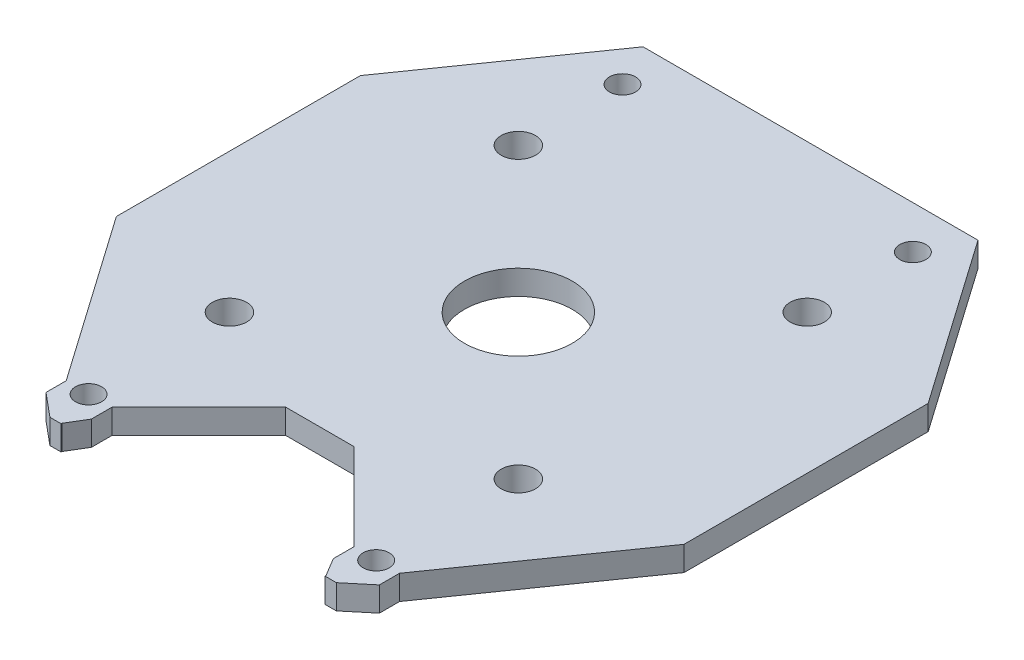
ISO-10303-21;
HEADER;
FILE_DESCRIPTION(('STEP AP214'),'2;1');
FILE_NAME('part.step','',(''),(''),'','','');
FILE_SCHEMA(('AUTOMOTIVE_DESIGN { 1 0 10303 214 1 1 1 1 }'));
ENDSEC;
DATA;
#1=APPLICATION_CONTEXT('core data for automotive mechanical design processes');
#2=APPLICATION_PROTOCOL_DEFINITION('international standard','automotive_design',2000,#1);
#3=PRODUCT_CONTEXT('',#1,'mechanical');
#4=PRODUCT('Part','Part','',(#3));
#5=PRODUCT_RELATED_PRODUCT_CATEGORY('part','',(#4));
#6=PRODUCT_DEFINITION_FORMATION('','',#4);
#7=PRODUCT_DEFINITION_CONTEXT('part definition',#1,'design');
#8=PRODUCT_DEFINITION('design','',#6,#7);
#9=PRODUCT_DEFINITION_SHAPE('','',#8);
#10=(LENGTH_UNIT() NAMED_UNIT(*) SI_UNIT(.MILLI.,.METRE.));
#11=(NAMED_UNIT(*) PLANE_ANGLE_UNIT() SI_UNIT($,.RADIAN.));
#12=(NAMED_UNIT(*) SI_UNIT($,.STERADIAN.) SOLID_ANGLE_UNIT());
#13=UNCERTAINTY_MEASURE_WITH_UNIT(LENGTH_MEASURE(1.E-05),#10,'distance_accuracy_value','');
#14=(GEOMETRIC_REPRESENTATION_CONTEXT(3) GLOBAL_UNCERTAINTY_ASSIGNED_CONTEXT((#13)) GLOBAL_UNIT_ASSIGNED_CONTEXT((#10,
#11,#12)) REPRESENTATION_CONTEXT('',''));
#15=CARTESIAN_POINT('',(0.,0.,0.));
#16=DIRECTION('',(0.,0.,1.));
#17=DIRECTION('',(1.,0.,0.));
#18=AXIS2_PLACEMENT_3D('',#15,#16,#17);
#19=CARTESIAN_POINT('',(65.7919970779048,8.,-46.0680523078203));
#20=DIRECTION('',(-0.819152044288991,0.,0.573576436351048));
#21=DIRECTION('',(0.573576436351048,0.,0.819152044288991));
#22=AXIS2_PLACEMENT_3D('',#19,#20,#21);
#23=PLANE('',#22);
#24=DIRECTION('',(-0.573576436351048,0.,-0.819152044288991));
#25=VECTOR('',#24,1.);
#26=CARTESIAN_POINT('',(65.7919970779048,5.,-46.0680523078203));
#27=LINE('',#26,#25);
#28=CARTESIAN_POINT('',(34.739410908776,5.,-90.4157413494491));
#29=VERTEX_POINT('',#28);
#30=CARTESIAN_POINT('',(20.4958865898895,5.,-110.75760221445));
#31=VERTEX_POINT('',#30);
#32=EDGE_CURVE('E253',#29,#31,#27,.T.);
#33=ORIENTED_EDGE('',*,*,#32,.T.);
#34=DIRECTION('',(0.,-1.,0.));
#35=VECTOR('',#34,1.);
#36=CARTESIAN_POINT('',(20.4958865898895,8.,-110.75760221445));
#37=LINE('',#36,#35);
#38=CARTESIAN_POINT('',(20.4958865898895,8.,-110.75760221445));
#39=VERTEX_POINT('',#38);
#40=EDGE_CURVE('E11',#39,#31,#37,.T.);
#41=ORIENTED_EDGE('',*,*,#40,.F.);
#42=DIRECTION('',(-0.573576436351048,0.,-0.819152044288991));
#43=VECTOR('',#42,1.);
#44=CARTESIAN_POINT('',(65.7919970779048,8.,-46.0680523078203));
#45=LINE('',#44,#43);
#46=CARTESIAN_POINT('',(34.739410908776,8.,-90.4157413494491));
#47=VERTEX_POINT('',#46);
#48=EDGE_CURVE('E428',#47,#39,#45,.T.);
#49=ORIENTED_EDGE('',*,*,#48,.F.);
#50=DIRECTION('',(0.,-1.,0.));
#51=VECTOR('',#50,1.);
#52=CARTESIAN_POINT('',(34.739410908776,8.,-90.4157413494491));
#53=LINE('',#52,#51);
#54=EDGE_CURVE('E240',#47,#29,#53,.T.);
#55=ORIENTED_EDGE('',*,*,#54,.T.);
#56=EDGE_LOOP('',(#33,#41,#49,#55));
#57=FACE_BOUND('',#56,.T.);
#58=ADVANCED_FACE('F44',(#57),#23,.F.);
#59=CARTESIAN_POINT('',(0.,8.,-110.75760221445));
#60=DIRECTION('',(0.,0.,1.));
#61=DIRECTION('',(1.,0.,0.));
#62=AXIS2_PLACEMENT_3D('',#59,#60,#61);
#63=PLANE('',#62);
#64=DIRECTION('',(-1.,0.,0.));
#65=VECTOR('',#64,1.);
#66=CARTESIAN_POINT('',(0.,5.,-110.75760221445));
#67=LINE('',#66,#65);
#68=CARTESIAN_POINT('',(-20.4958865898895,5.,-110.75760221445));
#69=VERTEX_POINT('',#68);
#70=EDGE_CURVE('E256',#31,#69,#67,.T.);
#71=ORIENTED_EDGE('',*,*,#70,.T.);
#72=DIRECTION('',(0.,-1.,0.));
#73=VECTOR('',#72,1.);
#74=CARTESIAN_POINT('',(-20.4958865898895,8.,-110.75760221445));
#75=LINE('',#74,#73);
#76=CARTESIAN_POINT('',(-20.4958865898895,8.,-110.75760221445));
#77=VERTEX_POINT('',#76);
#78=EDGE_CURVE('E53',#77,#69,#75,.T.);
#79=ORIENTED_EDGE('',*,*,#78,.F.);
#80=DIRECTION('',(-1.,0.,0.));
#81=VECTOR('',#80,1.);
#82=CARTESIAN_POINT('',(0.,8.,-110.75760221445));
#83=LINE('',#82,#81);
#84=EDGE_CURVE('E146',#39,#77,#83,.T.);
#85=ORIENTED_EDGE('',*,*,#84,.F.);
#86=ORIENTED_EDGE('',*,*,#40,.T.);
#87=EDGE_LOOP('',(#71,#79,#85,#86));
#88=FACE_BOUND('',#87,.T.);
#89=ADVANCED_FACE('F448',(#88),#63,.F.);
#90=CARTESIAN_POINT('',(-65.7919970779048,8.,-46.0680523078203));
#91=DIRECTION('',(0.819152044288991,0.,0.573576436351048));
#92=DIRECTION('',(0.573576436351048,0.,-0.819152044288991));
#93=AXIS2_PLACEMENT_3D('',#90,#91,#92);
#94=PLANE('',#93);
#95=DIRECTION('',(-0.573576436351048,0.,0.819152044288991));
#96=VECTOR('',#95,1.);
#97=CARTESIAN_POINT('',(-65.7919970779048,5.,-46.0680523078203));
#98=LINE('',#97,#96);
#99=CARTESIAN_POINT('',(-34.739410908776,5.,-90.4157413494491));
#100=VERTEX_POINT('',#99);
#101=EDGE_CURVE('E258',#69,#100,#98,.T.);
#102=ORIENTED_EDGE('',*,*,#101,.T.);
#103=DIRECTION('',(0.,-1.,0.));
#104=VECTOR('',#103,1.);
#105=CARTESIAN_POINT('',(-34.739410908776,8.,-90.4157413494491));
#106=LINE('',#105,#104);
#107=CARTESIAN_POINT('',(-34.739410908776,8.,-90.4157413494491));
#108=VERTEX_POINT('',#107);
#109=EDGE_CURVE('E359',#108,#100,#106,.T.);
#110=ORIENTED_EDGE('',*,*,#109,.F.);
#111=DIRECTION('',(-0.573576436351048,0.,0.819152044288991));
#112=VECTOR('',#111,1.);
#113=CARTESIAN_POINT('',(-65.7919970779048,8.,-46.0680523078203));
#114=LINE('',#113,#112);
#115=EDGE_CURVE('E367',#77,#108,#114,.T.);
#116=ORIENTED_EDGE('',*,*,#115,.F.);
#117=ORIENTED_EDGE('',*,*,#78,.T.);
#118=EDGE_LOOP('',(#102,#110,#116,#117));
#119=FACE_BOUND('',#118,.T.);
#120=ADVANCED_FACE('F365',(#119),#94,.F.);
#121=CARTESIAN_POINT('',(-34.739410908776,8.,0.));
#122=DIRECTION('',(1.,0.,0.));
#123=DIRECTION('',(0.,0.,-1.));
#124=AXIS2_PLACEMENT_3D('',#121,#122,#123);
#125=PLANE('',#124);
#126=DIRECTION('',(0.,0.,1.));
#127=VECTOR('',#126,1.);
#128=CARTESIAN_POINT('',(-34.739410908776,5.,0.));
#129=LINE('',#128,#127);
#130=CARTESIAN_POINT('',(-34.739410908776,5.,-60.5418608650007));
#131=VERTEX_POINT('',#130);
#132=EDGE_CURVE('E260',#100,#131,#129,.T.);
#133=ORIENTED_EDGE('',*,*,#132,.T.);
#134=DIRECTION('',(0.,-1.,0.));
#135=VECTOR('',#134,1.);
#136=CARTESIAN_POINT('',(-34.739410908776,8.,-60.5418608650007));
#137=LINE('',#136,#135);
#138=CARTESIAN_POINT('',(-34.739410908776,8.,-60.5418608650007));
#139=VERTEX_POINT('',#138);
#140=EDGE_CURVE('E356',#139,#131,#137,.T.);
#141=ORIENTED_EDGE('',*,*,#140,.F.);
#142=DIRECTION('',(0.,0.,1.));
#143=VECTOR('',#142,1.);
#144=CARTESIAN_POINT('',(-34.739410908776,8.,0.));
#145=LINE('',#144,#143);
#146=EDGE_CURVE('E386',#108,#139,#145,.T.);
#147=ORIENTED_EDGE('',*,*,#146,.F.);
#148=ORIENTED_EDGE('',*,*,#109,.T.);
#149=EDGE_LOOP('',(#133,#141,#147,#148));
#150=FACE_BOUND('',#149,.T.);
#151=ADVANCED_FACE('F377',(#150),#125,.F.);
#152=CARTESIAN_POINT('',(5.13487534832138,8.,-3.59547842666179));
#153=DIRECTION('',(0.819152044288995,0.,-0.573576436351041));
#154=DIRECTION('',(-0.573576436351041,0.,-0.819152044288995));
#155=AXIS2_PLACEMENT_3D('',#152,#153,#154);
#156=PLANE('',#155);
#157=DIRECTION('',(0.573576436351041,0.,0.819152044288995));
#158=VECTOR('',#157,1.);
#159=CARTESIAN_POINT('',(5.13487534832138,5.,-3.59547842666179));
#160=LINE('',#159,#158);
#161=CARTESIAN_POINT('',(-20.3999999999998,5.,-40.0630597577755));
#162=VERTEX_POINT('',#161);
#163=EDGE_CURVE('E262',#131,#162,#160,.T.);
#164=ORIENTED_EDGE('',*,*,#163,.T.);
#165=DIRECTION('',(0.,-1.,0.));
#166=VECTOR('',#165,1.);
#167=CARTESIAN_POINT('',(-20.3999999999998,8.,-40.0630597577755));
#168=LINE('',#167,#166);
#169=CARTESIAN_POINT('',(-20.3999999999998,8.,-40.0630597577755));
#170=VERTEX_POINT('',#169);
#171=EDGE_CURVE('E353',#170,#162,#168,.T.);
#172=ORIENTED_EDGE('',*,*,#171,.F.);
#173=DIRECTION('',(0.573576436351041,0.,0.819152044288995));
#174=VECTOR('',#173,1.);
#175=CARTESIAN_POINT('',(5.13487534832138,8.,-3.59547842666179));
#176=LINE('',#175,#174);
#177=EDGE_CURVE('E383',#139,#170,#176,.T.);
#178=ORIENTED_EDGE('',*,*,#177,.F.);
#179=ORIENTED_EDGE('',*,*,#140,.T.);
#180=EDGE_LOOP('',(#164,#172,#178,#179));
#181=FACE_BOUND('',#180,.T.);
#182=ADVANCED_FACE('F381',(#181),#156,.F.);
#183=CARTESIAN_POINT('',(-20.3999999999998,8.,0.));
#184=DIRECTION('',(1.,0.,0.));
#185=DIRECTION('',(0.,0.,-1.));
#186=AXIS2_PLACEMENT_3D('',#183,#184,#185);
#187=PLANE('',#186);
#188=DIRECTION('',(0.,0.,1.));
#189=VECTOR('',#188,1.);
#190=CARTESIAN_POINT('',(-20.3999999999998,5.,0.));
#191=LINE('',#190,#189);
#192=CARTESIAN_POINT('',(-20.3999999999998,5.,-37.5936749891967));
#193=VERTEX_POINT('',#192);
#194=EDGE_CURVE('E264',#162,#193,#191,.T.);
#195=ORIENTED_EDGE('',*,*,#194,.T.);
#196=DIRECTION('',(0.,-1.,0.));
#197=VECTOR('',#196,1.);
#198=CARTESIAN_POINT('',(-20.3999999999998,8.,-37.5936749891967));
#199=LINE('',#198,#197);
#200=CARTESIAN_POINT('',(-20.3999999999998,8.,-37.5936749891967));
#201=VERTEX_POINT('',#200);
#202=EDGE_CURVE('E350',#201,#193,#199,.T.);
#203=ORIENTED_EDGE('',*,*,#202,.F.);
#204=DIRECTION('',(0.,0.,1.));
#205=VECTOR('',#204,1.);
#206=CARTESIAN_POINT('',(-20.3999999999998,8.,0.));
#207=LINE('',#206,#205);
#208=EDGE_CURVE('E385',#170,#201,#207,.T.);
#209=ORIENTED_EDGE('',*,*,#208,.F.);
#210=ORIENTED_EDGE('',*,*,#171,.T.);
#211=EDGE_LOOP('',(#195,#203,#209,#210));
#212=FACE_BOUND('',#211,.T.);
#213=ADVANCED_FACE('F709',(#212),#187,.F.);
#214=CARTESIAN_POINT('',(10.1280368799329,8.,-12.1536442559195));
#215=DIRECTION('',(0.640184399664479,0.,-0.768221279597376));
#216=DIRECTION('',(-0.768221279597376,0.,-0.640184399664479));
#217=AXIS2_PLACEMENT_3D('',#214,#215,#216);
#218=PLANE('',#217);
#219=DIRECTION('',(0.768221279597376,0.,0.640184399664479));
#220=VECTOR('',#219,1.);
#221=CARTESIAN_POINT('',(10.1280368799329,5.,-12.1536442559195));
#222=LINE('',#221,#220);
#223=CARTESIAN_POINT('',(-17.5275900129637,5.,-35.2));
#224=VERTEX_POINT('',#223);
#225=EDGE_CURVE('E266',#193,#224,#222,.T.);
#226=ORIENTED_EDGE('',*,*,#225,.T.);
#227=DIRECTION('',(0.,-1.,0.));
#228=VECTOR('',#227,1.);
#229=CARTESIAN_POINT('',(-17.5275900129637,8.,-35.2));
#230=LINE('',#229,#228);
#231=CARTESIAN_POINT('',(-17.5275900129637,8.,-35.2));
#232=VERTEX_POINT('',#231);
#233=EDGE_CURVE('E347',#232,#224,#230,.T.);
#234=ORIENTED_EDGE('',*,*,#233,.F.);
#235=DIRECTION('',(0.768221279597376,0.,0.640184399664479));
#236=VECTOR('',#235,1.);
#237=CARTESIAN_POINT('',(10.1280368799329,8.,-12.1536442559195));
#238=LINE('',#237,#236);
#239=EDGE_CURVE('E388',#201,#232,#238,.T.);
#240=ORIENTED_EDGE('',*,*,#239,.F.);
#241=ORIENTED_EDGE('',*,*,#202,.T.);
#242=EDGE_LOOP('',(#226,#234,#240,#241));
#243=FACE_BOUND('',#242,.T.);
#244=ADVANCED_FACE('F701',(#243),#218,.F.);
#245=CARTESIAN_POINT('',(0.,8.,-35.2));
#246=DIRECTION('',(0.,0.,-1.));
#247=DIRECTION('',(-1.,0.,0.));
#248=AXIS2_PLACEMENT_3D('',#245,#246,#247);
#249=PLANE('',#248);
#250=DIRECTION('',(1.,0.,0.));
#251=VECTOR('',#250,1.);
#252=CARTESIAN_POINT('',(0.,5.,-35.2));
#253=LINE('',#252,#251);
#254=CARTESIAN_POINT('',(-16.1582607431014,5.,-35.2));
#255=VERTEX_POINT('',#254);
#256=EDGE_CURVE('E268',#224,#255,#253,.T.);
#257=ORIENTED_EDGE('',*,*,#256,.T.);
#258=DIRECTION('',(0.,-1.,0.));
#259=VECTOR('',#258,1.);
#260=CARTESIAN_POINT('',(-16.1582607431014,8.,-35.2));
#261=LINE('',#260,#259);
#262=CARTESIAN_POINT('',(-16.1582607431014,8.,-35.2));
#263=VERTEX_POINT('',#262);
#264=EDGE_CURVE('E344',#263,#255,#261,.T.);
#265=ORIENTED_EDGE('',*,*,#264,.F.);
#266=DIRECTION('',(1.,0.,0.));
#267=VECTOR('',#266,1.);
#268=CARTESIAN_POINT('',(0.,8.,-35.2));
#269=LINE('',#268,#267);
#270=EDGE_CURVE('E394',#232,#263,#269,.T.);
#271=ORIENTED_EDGE('',*,*,#270,.F.);
#272=ORIENTED_EDGE('',*,*,#233,.T.);
#273=EDGE_LOOP('',(#257,#265,#271,#272));
#274=FACE_BOUND('',#273,.T.);
#275=ADVANCED_FACE('F693',(#274),#249,.F.);
#276=CARTESIAN_POINT('',(-16.1582607431014,8.,0.));
#277=DIRECTION('',(-1.,0.,0.));
#278=DIRECTION('',(0.,0.,1.));
#279=AXIS2_PLACEMENT_3D('',#276,#277,#278);
#280=PLANE('',#279);
#281=DIRECTION('',(0.,0.,-1.));
#282=VECTOR('',#281,1.);
#283=CARTESIAN_POINT('',(-16.1582607431014,5.,0.));
#284=LINE('',#283,#282);
#285=CARTESIAN_POINT('',(-16.1582607431014,5.,-35.2916288878207));
#286=VERTEX_POINT('',#285);
#287=EDGE_CURVE('E270',#255,#286,#284,.T.);
#288=ORIENTED_EDGE('',*,*,#287,.T.);
#289=DIRECTION('',(0.,-1.,0.));
#290=VECTOR('',#289,1.);
#291=CARTESIAN_POINT('',(-16.1582607431014,8.,-35.2916288878207));
#292=LINE('',#291,#290);
#293=CARTESIAN_POINT('',(-16.1582607431014,8.,-35.2916288878207));
#294=VERTEX_POINT('',#293);
#295=EDGE_CURVE('E341',#294,#286,#292,.T.);
#296=ORIENTED_EDGE('',*,*,#295,.F.);
#297=DIRECTION('',(0.,0.,-1.));
#298=VECTOR('',#297,1.);
#299=CARTESIAN_POINT('',(-16.1582607431014,8.,0.));
#300=LINE('',#299,#298);
#301=EDGE_CURVE('E396',#263,#294,#300,.T.);
#302=ORIENTED_EDGE('',*,*,#301,.F.);
#303=ORIENTED_EDGE('',*,*,#264,.T.);
#304=EDGE_LOOP('',(#288,#296,#302,#303));
#305=FACE_BOUND('',#304,.T.);
#306=ADVANCED_FACE('F685',(#305),#280,.F.);
#307=CARTESIAN_POINT('',(-27.4509103498484,8.,-16.470546209909));
#308=DIRECTION('',(-0.857492925712545,0.,-0.514495755427526));
#309=DIRECTION('',(-0.514495755427526,0.,0.857492925712545));
#310=AXIS2_PLACEMENT_3D('',#307,#308,#309);
#311=PLANE('',#310);
#312=DIRECTION('',(0.514495755427526,0.,-0.857492925712545));
#313=VECTOR('',#312,1.);
#314=CARTESIAN_POINT('',(-27.4509103498484,5.,-16.470546209909));
#315=LINE('',#314,#313);
#316=CARTESIAN_POINT('',(-14.8,5.,-37.5553967929897));
#317=VERTEX_POINT('',#316);
#318=EDGE_CURVE('E272',#286,#317,#315,.T.);
#319=ORIENTED_EDGE('',*,*,#318,.T.);
#320=DIRECTION('',(0.,-1.,0.));
#321=VECTOR('',#320,1.);
#322=CARTESIAN_POINT('',(-14.8,8.,-37.5553967929897));
#323=LINE('',#322,#321);
#324=CARTESIAN_POINT('',(-14.8,8.,-37.5553967929897));
#325=VERTEX_POINT('',#324);
#326=EDGE_CURVE('E338',#325,#317,#323,.T.);
#327=ORIENTED_EDGE('',*,*,#326,.F.);
#328=DIRECTION('',(0.514495755427526,0.,-0.857492925712545));
#329=VECTOR('',#328,1.);
#330=CARTESIAN_POINT('',(-27.4509103498484,8.,-16.470546209909));
#331=LINE('',#330,#329);
#332=EDGE_CURVE('E398',#294,#325,#331,.T.);
#333=ORIENTED_EDGE('',*,*,#332,.F.);
#334=ORIENTED_EDGE('',*,*,#295,.T.);
#335=EDGE_LOOP('',(#319,#327,#333,#334));
#336=FACE_BOUND('',#335,.T.);
#337=ADVANCED_FACE('F677',(#336),#311,.F.);
#338=CARTESIAN_POINT('',(-14.8,8.,0.));
#339=DIRECTION('',(-1.,0.,0.));
#340=DIRECTION('',(0.,0.,1.));
#341=AXIS2_PLACEMENT_3D('',#338,#339,#340);
#342=PLANE('',#341);
#343=DIRECTION('',(0.,0.,-1.));
#344=VECTOR('',#343,1.);
#345=CARTESIAN_POINT('',(-14.8,5.,0.));
#346=LINE('',#345,#344);
#347=CARTESIAN_POINT('',(-14.8,5.,-40.0828427124746));
#348=VERTEX_POINT('',#347);
#349=EDGE_CURVE('E274',#317,#348,#346,.T.);
#350=ORIENTED_EDGE('',*,*,#349,.T.);
#351=DIRECTION('',(0.,-1.,0.));
#352=VECTOR('',#351,1.);
#353=CARTESIAN_POINT('',(-14.8,8.,-40.0828427124746));
#354=LINE('',#353,#352);
#355=CARTESIAN_POINT('',(-14.8,8.,-40.0828427124746));
#356=VERTEX_POINT('',#355);
#357=EDGE_CURVE('E335',#356,#348,#354,.T.);
#358=ORIENTED_EDGE('',*,*,#357,.F.);
#359=DIRECTION('',(0.,0.,-1.));
#360=VECTOR('',#359,1.);
#361=CARTESIAN_POINT('',(-14.8,8.,0.));
#362=LINE('',#361,#360);
#363=EDGE_CURVE('E400',#325,#356,#362,.T.);
#364=ORIENTED_EDGE('',*,*,#363,.F.);
#365=ORIENTED_EDGE('',*,*,#326,.T.);
#366=EDGE_LOOP('',(#350,#358,#364,#365));
#367=FACE_BOUND('',#366,.T.);
#368=ADVANCED_FACE('F669',(#367),#342,.F.);
#369=CARTESIAN_POINT('',(-27.4414213562373,8.,-27.4414213562373));
#370=DIRECTION('',(-0.707106781186547,0.,-0.707106781186548));
#371=DIRECTION('',(-0.707106781186548,0.,0.707106781186547));
#372=AXIS2_PLACEMENT_3D('',#369,#370,#371);
#373=PLANE('',#372);
#374=DIRECTION('',(0.707106781186548,0.,-0.707106781186547));
#375=VECTOR('',#374,1.);
#376=CARTESIAN_POINT('',(-27.4414213562373,5.,-27.4414213562373));
#377=LINE('',#376,#375);
#378=CARTESIAN_POINT('',(-4.18284271247462,5.,-50.7));
#379=VERTEX_POINT('',#378);
#380=EDGE_CURVE('E276',#348,#379,#377,.T.);
#381=ORIENTED_EDGE('',*,*,#380,.T.);
#382=DIRECTION('',(0.,-1.,0.));
#383=VECTOR('',#382,1.);
#384=CARTESIAN_POINT('',(-4.18284271247462,8.,-50.7));
#385=LINE('',#384,#383);
#386=CARTESIAN_POINT('',(-4.18284271247462,8.,-50.7));
#387=VERTEX_POINT('',#386);
#388=EDGE_CURVE('E332',#387,#379,#385,.T.);
#389=ORIENTED_EDGE('',*,*,#388,.F.);
#390=DIRECTION('',(0.707106781186548,0.,-0.707106781186547));
#391=VECTOR('',#390,1.);
#392=CARTESIAN_POINT('',(-27.4414213562373,8.,-27.4414213562373));
#393=LINE('',#392,#391);
#394=EDGE_CURVE('E402',#356,#387,#393,.T.);
#395=ORIENTED_EDGE('',*,*,#394,.F.);
#396=ORIENTED_EDGE('',*,*,#357,.T.);
#397=EDGE_LOOP('',(#381,#389,#395,#396));
#398=FACE_BOUND('',#397,.T.);
#399=ADVANCED_FACE('F661',(#398),#373,.F.);
#400=CARTESIAN_POINT('',(0.,8.,-50.7));
#401=DIRECTION('',(0.,0.,-1.));
#402=DIRECTION('',(-1.,0.,0.));
#403=AXIS2_PLACEMENT_3D('',#400,#401,#402);
#404=PLANE('',#403);
#405=DIRECTION('',(1.,0.,0.));
#406=VECTOR('',#405,1.);
#407=CARTESIAN_POINT('',(0.,5.,-50.7));
#408=LINE('',#407,#406);
#409=CARTESIAN_POINT('',(4.18284271247474,5.,-50.7));
#410=VERTEX_POINT('',#409);
#411=EDGE_CURVE('E278',#379,#410,#408,.T.);
#412=ORIENTED_EDGE('',*,*,#411,.T.);
#413=DIRECTION('',(0.,-1.,0.));
#414=VECTOR('',#413,1.);
#415=CARTESIAN_POINT('',(4.18284271247474,8.,-50.7));
#416=LINE('',#415,#414);
#417=CARTESIAN_POINT('',(4.18284271247474,8.,-50.7));
#418=VERTEX_POINT('',#417);
#419=EDGE_CURVE('E329',#418,#410,#416,.T.);
#420=ORIENTED_EDGE('',*,*,#419,.F.);
#421=DIRECTION('',(1.,0.,0.));
#422=VECTOR('',#421,1.);
#423=CARTESIAN_POINT('',(0.,8.,-50.7));
#424=LINE('',#423,#422);
#425=EDGE_CURVE('E404',#387,#418,#424,.T.);
#426=ORIENTED_EDGE('',*,*,#425,.F.);
#427=ORIENTED_EDGE('',*,*,#388,.T.);
#428=EDGE_LOOP('',(#412,#420,#426,#427));
#429=FACE_BOUND('',#428,.T.);
#430=ADVANCED_FACE('F653',(#429),#404,.F.);
#431=CARTESIAN_POINT('',(27.4414213562374,8.,-27.4414213562371));
#432=DIRECTION('',(0.707106781186551,0.,-0.707106781186544));
#433=DIRECTION('',(-0.707106781186544,0.,-0.707106781186551));
#434=AXIS2_PLACEMENT_3D('',#431,#432,#433);
#435=PLANE('',#434);
#436=DIRECTION('',(0.707106781186544,0.,0.707106781186551));
#437=VECTOR('',#436,1.);
#438=CARTESIAN_POINT('',(27.4414213562374,5.,-27.4414213562371));
#439=LINE('',#438,#437);
#440=CARTESIAN_POINT('',(14.8,5.,-40.0828427124746));
#441=VERTEX_POINT('',#440);
#442=EDGE_CURVE('E280',#410,#441,#439,.T.);
#443=ORIENTED_EDGE('',*,*,#442,.T.);
#444=DIRECTION('',(0.,-1.,0.));
#445=VECTOR('',#444,1.);
#446=CARTESIAN_POINT('',(14.8,8.,-40.0828427124746));
#447=LINE('',#446,#445);
#448=CARTESIAN_POINT('',(14.8,8.,-40.0828427124746));
#449=VERTEX_POINT('',#448);
#450=EDGE_CURVE('E326',#449,#441,#447,.T.);
#451=ORIENTED_EDGE('',*,*,#450,.F.);
#452=DIRECTION('',(0.707106781186544,0.,0.707106781186551));
#453=VECTOR('',#452,1.);
#454=CARTESIAN_POINT('',(27.4414213562374,8.,-27.4414213562371));
#455=LINE('',#454,#453);
#456=EDGE_CURVE('E406',#418,#449,#455,.T.);
#457=ORIENTED_EDGE('',*,*,#456,.F.);
#458=ORIENTED_EDGE('',*,*,#419,.T.);
#459=EDGE_LOOP('',(#443,#451,#457,#458));
#460=FACE_BOUND('',#459,.T.);
#461=ADVANCED_FACE('F645',(#460),#435,.F.);
#462=CARTESIAN_POINT('',(14.8,8.,0.));
#463=DIRECTION('',(1.,0.,0.));
#464=DIRECTION('',(0.,0.,-1.));
#465=AXIS2_PLACEMENT_3D('',#462,#463,#464);
#466=PLANE('',#465);
#467=DIRECTION('',(0.,0.,1.));
#468=VECTOR('',#467,1.);
#469=CARTESIAN_POINT('',(14.8,5.,0.));
#470=LINE('',#469,#468);
#471=CARTESIAN_POINT('',(14.8,5.,-37.5553967929897));
#472=VERTEX_POINT('',#471);
#473=EDGE_CURVE('E282',#441,#472,#470,.T.);
#474=ORIENTED_EDGE('',*,*,#473,.T.);
#475=DIRECTION('',(0.,-1.,0.));
#476=VECTOR('',#475,1.);
#477=CARTESIAN_POINT('',(14.8,8.,-37.5553967929897));
#478=LINE('',#477,#476);
#479=CARTESIAN_POINT('',(14.8,8.,-37.5553967929897));
#480=VERTEX_POINT('',#479);
#481=EDGE_CURVE('E323',#480,#472,#478,.T.);
#482=ORIENTED_EDGE('',*,*,#481,.F.);
#483=DIRECTION('',(0.,0.,1.));
#484=VECTOR('',#483,1.);
#485=CARTESIAN_POINT('',(14.8,8.,0.));
#486=LINE('',#485,#484);
#487=EDGE_CURVE('E408',#449,#480,#486,.T.);
#488=ORIENTED_EDGE('',*,*,#487,.F.);
#489=ORIENTED_EDGE('',*,*,#450,.T.);
#490=EDGE_LOOP('',(#474,#482,#488,#489));
#491=FACE_BOUND('',#490,.T.);
#492=ADVANCED_FACE('F637',(#491),#466,.F.);
#493=CARTESIAN_POINT('',(27.4509103498484,8.,-16.470546209909));
#494=DIRECTION('',(0.857492925712545,0.,-0.514495755427526));
#495=DIRECTION('',(-0.514495755427526,0.,-0.857492925712545));
#496=AXIS2_PLACEMENT_3D('',#493,#494,#495);
#497=PLANE('',#496);
#498=DIRECTION('',(0.514495755427526,0.,0.857492925712545));
#499=VECTOR('',#498,1.);
#500=CARTESIAN_POINT('',(27.4509103498484,5.,-16.470546209909));
#501=LINE('',#500,#499);
#502=CARTESIAN_POINT('',(16.1582607431014,5.,-35.2916288878207));
#503=VERTEX_POINT('',#502);
#504=EDGE_CURVE('E284',#472,#503,#501,.T.);
#505=ORIENTED_EDGE('',*,*,#504,.T.);
#506=DIRECTION('',(0.,-1.,0.));
#507=VECTOR('',#506,1.);
#508=CARTESIAN_POINT('',(16.1582607431014,8.,-35.2916288878207));
#509=LINE('',#508,#507);
#510=CARTESIAN_POINT('',(16.1582607431014,8.,-35.2916288878207));
#511=VERTEX_POINT('',#510);
#512=EDGE_CURVE('E320',#511,#503,#509,.T.);
#513=ORIENTED_EDGE('',*,*,#512,.F.);
#514=DIRECTION('',(0.514495755427526,0.,0.857492925712545));
#515=VECTOR('',#514,1.);
#516=CARTESIAN_POINT('',(27.4509103498484,8.,-16.470546209909));
#517=LINE('',#516,#515);
#518=EDGE_CURVE('E410',#480,#511,#517,.T.);
#519=ORIENTED_EDGE('',*,*,#518,.F.);
#520=ORIENTED_EDGE('',*,*,#481,.T.);
#521=EDGE_LOOP('',(#505,#513,#519,#520));
#522=FACE_BOUND('',#521,.T.);
#523=ADVANCED_FACE('F629',(#522),#497,.F.);
#524=CARTESIAN_POINT('',(16.1582607431014,8.,0.));
#525=DIRECTION('',(1.,0.,0.));
#526=DIRECTION('',(0.,0.,-1.));
#527=AXIS2_PLACEMENT_3D('',#524,#525,#526);
#528=PLANE('',#527);
#529=DIRECTION('',(0.,0.,1.));
#530=VECTOR('',#529,1.);
#531=CARTESIAN_POINT('',(16.1582607431014,5.,0.));
#532=LINE('',#531,#530);
#533=CARTESIAN_POINT('',(16.1582607431014,5.,-35.2));
#534=VERTEX_POINT('',#533);
#535=EDGE_CURVE('E286',#503,#534,#532,.T.);
#536=ORIENTED_EDGE('',*,*,#535,.T.);
#537=DIRECTION('',(0.,-1.,0.));
#538=VECTOR('',#537,1.);
#539=CARTESIAN_POINT('',(16.1582607431014,8.,-35.2));
#540=LINE('',#539,#538);
#541=CARTESIAN_POINT('',(16.1582607431014,8.,-35.2));
#542=VERTEX_POINT('',#541);
#543=EDGE_CURVE('E317',#542,#534,#540,.T.);
#544=ORIENTED_EDGE('',*,*,#543,.F.);
#545=DIRECTION('',(0.,0.,1.));
#546=VECTOR('',#545,1.);
#547=CARTESIAN_POINT('',(16.1582607431014,8.,0.));
#548=LINE('',#547,#546);
#549=EDGE_CURVE('E412',#511,#542,#548,.T.);
#550=ORIENTED_EDGE('',*,*,#549,.F.);
#551=ORIENTED_EDGE('',*,*,#512,.T.);
#552=EDGE_LOOP('',(#536,#544,#550,#551));
#553=FACE_BOUND('',#552,.T.);
#554=ADVANCED_FACE('F622',(#553),#528,.F.);
#555=CARTESIAN_POINT('',(0.,8.,-35.2));
#556=DIRECTION('',(0.,0.,-1.));
#557=DIRECTION('',(-1.,0.,0.));
#558=AXIS2_PLACEMENT_3D('',#555,#556,#557);
#559=PLANE('',#558);
#560=DIRECTION('',(1.,0.,0.));
#561=VECTOR('',#560,1.);
#562=CARTESIAN_POINT('',(0.,5.,-35.2));
#563=LINE('',#562,#561);
#564=CARTESIAN_POINT('',(17.5275900129637,5.,-35.2));
#565=VERTEX_POINT('',#564);
#566=EDGE_CURVE('E288',#534,#565,#563,.T.);
#567=ORIENTED_EDGE('',*,*,#566,.T.);
#568=DIRECTION('',(0.,-1.,0.));
#569=VECTOR('',#568,1.);
#570=CARTESIAN_POINT('',(17.5275900129637,8.,-35.2));
#571=LINE('',#570,#569);
#572=CARTESIAN_POINT('',(17.5275900129637,8.,-35.2));
#573=VERTEX_POINT('',#572);
#574=EDGE_CURVE('E314',#573,#565,#571,.T.);
#575=ORIENTED_EDGE('',*,*,#574,.F.);
#576=DIRECTION('',(1.,0.,0.));
#577=VECTOR('',#576,1.);
#578=CARTESIAN_POINT('',(0.,8.,-35.2));
#579=LINE('',#578,#577);
#580=EDGE_CURVE('E414',#542,#573,#579,.T.);
#581=ORIENTED_EDGE('',*,*,#580,.F.);
#582=ORIENTED_EDGE('',*,*,#543,.T.);
#583=EDGE_LOOP('',(#567,#575,#581,#582));
#584=FACE_BOUND('',#583,.T.);
#585=ADVANCED_FACE('F420',(#584),#559,.F.);
#586=CARTESIAN_POINT('',(-10.1280368799329,8.,-12.1536442559195));
#587=DIRECTION('',(-0.64018439966448,0.,-0.768221279597376));
#588=DIRECTION('',(-0.768221279597376,0.,0.64018439966448));
#589=AXIS2_PLACEMENT_3D('',#586,#587,#588);
#590=PLANE('',#589);
#591=DIRECTION('',(0.768221279597376,0.,-0.64018439966448));
#592=VECTOR('',#591,1.);
#593=CARTESIAN_POINT('',(-10.1280368799329,5.,-12.1536442559195));
#594=LINE('',#593,#592);
#595=CARTESIAN_POINT('',(20.4,5.,-37.5936749891969));
#596=VERTEX_POINT('',#595);
#597=EDGE_CURVE('E290',#565,#596,#594,.T.);
#598=ORIENTED_EDGE('',*,*,#597,.T.);
#599=DIRECTION('',(0.,-1.,0.));
#600=VECTOR('',#599,1.);
#601=CARTESIAN_POINT('',(20.4,8.,-37.5936749891969));
#602=LINE('',#601,#600);
#603=CARTESIAN_POINT('',(20.4,8.,-37.5936749891969));
#604=VERTEX_POINT('',#603);
#605=EDGE_CURVE('E217',#604,#596,#602,.T.);
#606=ORIENTED_EDGE('',*,*,#605,.F.);
#607=DIRECTION('',(0.768221279597376,0.,-0.64018439966448));
#608=VECTOR('',#607,1.);
#609=CARTESIAN_POINT('',(-10.1280368799329,8.,-12.1536442559195));
#610=LINE('',#609,#608);
#611=EDGE_CURVE('E208',#573,#604,#610,.T.);
#612=ORIENTED_EDGE('',*,*,#611,.F.);
#613=ORIENTED_EDGE('',*,*,#574,.T.);
#614=EDGE_LOOP('',(#598,#606,#612,#613));
#615=FACE_BOUND('',#614,.T.);
#616=ADVANCED_FACE('F424',(#615),#590,.F.);
#617=CARTESIAN_POINT('',(20.4,8.,0.));
#618=DIRECTION('',(-1.,0.,0.));
#619=DIRECTION('',(0.,0.,1.));
#620=AXIS2_PLACEMENT_3D('',#617,#618,#619);
#621=PLANE('',#620);
#622=DIRECTION('',(0.,0.,-1.));
#623=VECTOR('',#622,1.);
#624=CARTESIAN_POINT('',(20.4,5.,0.));
#625=LINE('',#624,#623);
#626=CARTESIAN_POINT('',(20.4,5.,-40.0630597577758));
#627=VERTEX_POINT('',#626);
#628=EDGE_CURVE('E216',#596,#627,#625,.T.);
#629=ORIENTED_EDGE('',*,*,#628,.T.);
#630=DIRECTION('',(0.,-1.,0.));
#631=VECTOR('',#630,1.);
#632=CARTESIAN_POINT('',(20.4,8.,-40.0630597577758));
#633=LINE('',#632,#631);
#634=CARTESIAN_POINT('',(20.4,8.,-40.0630597577758));
#635=VERTEX_POINT('',#634);
#636=EDGE_CURVE('E213',#635,#627,#633,.T.);
#637=ORIENTED_EDGE('',*,*,#636,.F.);
#638=DIRECTION('',(0.,0.,-1.));
#639=VECTOR('',#638,1.);
#640=CARTESIAN_POINT('',(20.4,8.,0.));
#641=LINE('',#640,#639);
#642=EDGE_CURVE('E201',#604,#635,#641,.T.);
#643=ORIENTED_EDGE('',*,*,#642,.F.);
#644=ORIENTED_EDGE('',*,*,#605,.T.);
#645=EDGE_LOOP('',(#629,#637,#643,#644));
#646=FACE_BOUND('',#645,.T.);
#647=ADVANCED_FACE('F214',(#646),#621,.F.);
#648=CARTESIAN_POINT('',(-5.13487534832138,8.,-3.59547842666179));
#649=DIRECTION('',(-0.819152044288995,0.,-0.573576436351041));
#650=DIRECTION('',(-0.573576436351041,0.,0.819152044288995));
#651=AXIS2_PLACEMENT_3D('',#648,#649,#650);
#652=PLANE('',#651);
#653=DIRECTION('',(0.573576436351041,0.,-0.819152044288995));
#654=VECTOR('',#653,1.);
#655=CARTESIAN_POINT('',(-5.13487534832138,5.,-3.59547842666179));
#656=LINE('',#655,#654);
#657=CARTESIAN_POINT('',(34.739410908776,5.,-60.5418608650007));
#658=VERTEX_POINT('',#657);
#659=EDGE_CURVE('E132',#627,#658,#656,.T.);
#660=ORIENTED_EDGE('',*,*,#659,.T.);
#661=DIRECTION('',(0.,-1.,0.));
#662=VECTOR('',#661,1.);
#663=CARTESIAN_POINT('',(34.739410908776,8.,-60.5418608650007));
#664=LINE('',#663,#662);
#665=CARTESIAN_POINT('',(34.739410908776,8.,-60.5418608650007));
#666=VERTEX_POINT('',#665);
#667=EDGE_CURVE('E218',#666,#658,#664,.T.);
#668=ORIENTED_EDGE('',*,*,#667,.F.);
#669=DIRECTION('',(0.573576436351041,0.,-0.819152044288995));
#670=VECTOR('',#669,1.);
#671=CARTESIAN_POINT('',(-5.13487534832138,8.,-3.59547842666179));
#672=LINE('',#671,#670);
#673=EDGE_CURVE('E206',#635,#666,#672,.T.);
#674=ORIENTED_EDGE('',*,*,#673,.F.);
#675=ORIENTED_EDGE('',*,*,#636,.T.);
#676=EDGE_LOOP('',(#660,#668,#674,#675));
#677=FACE_BOUND('',#676,.T.);
#678=ADVANCED_FACE('F220',(#677),#652,.F.);
#679=CARTESIAN_POINT('',(17.6776695296638,8.,-57.3223304703365));
#680=DIRECTION('',(0.,-1.,0.));
#681=DIRECTION('',(0.,0.,-1.));
#682=AXIS2_PLACEMENT_3D('',#679,#680,#681);
#683=CYLINDRICAL_SURFACE('',#682,2.1);
#684=CARTESIAN_POINT('',(17.6776695296638,8.,-57.3223304703365));
#685=DIRECTION('',(0.,1.,0.));
#686=DIRECTION('',(0.,0.,1.));
#687=AXIS2_PLACEMENT_3D('',#684,#685,#686);
#688=CIRCLE('',#687,2.1);
#689=CARTESIAN_POINT('',(17.6776695296638,8.,-55.2223304703365));
#690=VERTEX_POINT('',#689);
#691=EDGE_CURVE('E234',#690,#690,#688,.T.);
#692=ORIENTED_EDGE('',*,*,#691,.T.);
#693=EDGE_LOOP('',(#692));
#694=FACE_BOUND('',#693,.T.);
#695=CARTESIAN_POINT('',(17.6776695296638,5.,-57.3223304703365));
#696=DIRECTION('',(0.,1.,0.));
#697=DIRECTION('',(0.,0.,1.));
#698=AXIS2_PLACEMENT_3D('',#695,#696,#697);
#699=CIRCLE('',#698,2.1);
#700=CARTESIAN_POINT('',(17.6776695296638,5.,-55.2223304703365));
#701=VERTEX_POINT('',#700);
#702=EDGE_CURVE('E304',#701,#701,#699,.T.);
#703=ORIENTED_EDGE('',*,*,#702,.F.);
#704=EDGE_LOOP('',(#703));
#705=FACE_BOUND('',#704,.T.);
#706=ADVANCED_FACE('F495',(#694,#705),#683,.F.);
#707=CARTESIAN_POINT('',(17.6776695296635,8.,-92.6776695296639));
#708=DIRECTION('',(0.,-1.,0.));
#709=DIRECTION('',(0.,0.,-1.));
#710=AXIS2_PLACEMENT_3D('',#707,#708,#709);
#711=CYLINDRICAL_SURFACE('',#710,2.1);
#712=CARTESIAN_POINT('',(17.6776695296635,8.,-92.6776695296639));
#713=DIRECTION('',(0.,1.,0.));
#714=DIRECTION('',(0.,0.,1.));
#715=AXIS2_PLACEMENT_3D('',#712,#713,#714);
#716=CIRCLE('',#715,2.1);
#717=CARTESIAN_POINT('',(17.6776695296635,8.,-90.5776695296639));
#718=VERTEX_POINT('',#717);
#719=EDGE_CURVE('E231',#718,#718,#716,.T.);
#720=ORIENTED_EDGE('',*,*,#719,.T.);
#721=EDGE_LOOP('',(#720));
#722=FACE_BOUND('',#721,.T.);
#723=CARTESIAN_POINT('',(17.6776695296635,5.,-92.6776695296639));
#724=DIRECTION('',(0.,1.,0.));
#725=DIRECTION('',(0.,0.,1.));
#726=AXIS2_PLACEMENT_3D('',#723,#724,#725);
#727=CIRCLE('',#726,2.1);
#728=CARTESIAN_POINT('',(17.6776695296635,5.,-90.5776695296639));
#729=VERTEX_POINT('',#728);
#730=EDGE_CURVE('E301',#729,#729,#727,.T.);
#731=ORIENTED_EDGE('',*,*,#730,.F.);
#732=EDGE_LOOP('',(#731));
#733=FACE_BOUND('',#732,.T.);
#734=ADVANCED_FACE('F498',(#722,#733),#711,.F.);
#735=CARTESIAN_POINT('',(-17.6776695296638,8.,-92.6776695296635));
#736=DIRECTION('',(0.,-1.,0.));
#737=DIRECTION('',(0.,0.,-1.));
#738=AXIS2_PLACEMENT_3D('',#735,#736,#737);
#739=CYLINDRICAL_SURFACE('',#738,2.1);
#740=CARTESIAN_POINT('',(-17.6776695296638,8.,-92.6776695296635));
#741=DIRECTION('',(0.,1.,0.));
#742=DIRECTION('',(0.,0.,1.));
#743=AXIS2_PLACEMENT_3D('',#740,#741,#742);
#744=CIRCLE('',#743,2.1);
#745=CARTESIAN_POINT('',(-17.6776695296638,8.,-90.5776695296635));
#746=VERTEX_POINT('',#745);
#747=EDGE_CURVE('E228',#746,#746,#744,.T.);
#748=ORIENTED_EDGE('',*,*,#747,.T.);
#749=EDGE_LOOP('',(#748));
#750=FACE_BOUND('',#749,.T.);
#751=CARTESIAN_POINT('',(-17.6776695296638,5.,-92.6776695296635));
#752=DIRECTION('',(0.,1.,0.));
#753=DIRECTION('',(0.,0.,1.));
#754=AXIS2_PLACEMENT_3D('',#751,#752,#753);
#755=CIRCLE('',#754,2.1);
#756=CARTESIAN_POINT('',(-17.6776695296638,5.,-90.5776695296635));
#757=VERTEX_POINT('',#756);
#758=EDGE_CURVE('E298',#757,#757,#755,.T.);
#759=ORIENTED_EDGE('',*,*,#758,.F.);
#760=EDGE_LOOP('',(#759));
#761=FACE_BOUND('',#760,.T.);
#762=ADVANCED_FACE('F443',(#750,#761),#739,.F.);
#763=CARTESIAN_POINT('',(0.,8.,-75.));
#764=DIRECTION('',(0.,-1.,0.));
#765=DIRECTION('',(0.,0.,-1.));
#766=AXIS2_PLACEMENT_3D('',#763,#764,#765);
#767=CYLINDRICAL_SURFACE('',#766,6.59999999999999);
#768=CARTESIAN_POINT('',(0.,8.,-75.));
#769=DIRECTION('',(0.,1.,0.));
#770=DIRECTION('',(0.,0.,1.));
#771=AXIS2_PLACEMENT_3D('',#768,#769,#770);
#772=CIRCLE('',#771,6.59999999999999);
#773=CARTESIAN_POINT('',(0.,8.,-68.4));
#774=VERTEX_POINT('',#773);
#775=EDGE_CURVE('E222',#774,#774,#772,.T.);
#776=ORIENTED_EDGE('',*,*,#775,.T.);
#777=EDGE_LOOP('',(#776));
#778=FACE_BOUND('',#777,.T.);
#779=CARTESIAN_POINT('',(0.,5.,-75.));
#780=DIRECTION('',(0.,1.,0.));
#781=DIRECTION('',(0.,0.,1.));
#782=AXIS2_PLACEMENT_3D('',#779,#780,#781);
#783=CIRCLE('',#782,6.59999999999999);
#784=CARTESIAN_POINT('',(0.,5.,-68.4));
#785=VERTEX_POINT('',#784);
#786=EDGE_CURVE('E295',#785,#785,#783,.T.);
#787=ORIENTED_EDGE('',*,*,#786,.F.);
#788=EDGE_LOOP('',(#787));
#789=FACE_BOUND('',#788,.T.);
#790=ADVANCED_FACE('F432',(#778,#789),#767,.F.);
#791=CARTESIAN_POINT('',(34.739410908776,8.,0.));
#792=DIRECTION('',(-1.,0.,0.));
#793=DIRECTION('',(0.,0.,1.));
#794=AXIS2_PLACEMENT_3D('',#791,#792,#793);
#795=PLANE('',#794);
#796=DIRECTION('',(0.,0.,-1.));
#797=VECTOR('',#796,1.);
#798=CARTESIAN_POINT('',(34.739410908776,5.,0.));
#799=LINE('',#798,#797);
#800=EDGE_CURVE('E138',#658,#29,#799,.T.);
#801=ORIENTED_EDGE('',*,*,#800,.T.);
#802=ORIENTED_EDGE('',*,*,#54,.F.);
#803=DIRECTION('',(0.,0.,-1.));
#804=VECTOR('',#803,1.);
#805=CARTESIAN_POINT('',(34.739410908776,8.,0.));
#806=LINE('',#805,#804);
#807=EDGE_CURVE('E61',#666,#47,#806,.T.);
#808=ORIENTED_EDGE('',*,*,#807,.F.);
#809=ORIENTED_EDGE('',*,*,#667,.T.);
#810=EDGE_LOOP('',(#801,#802,#808,#809));
#811=FACE_BOUND('',#810,.T.);
#812=ADVANCED_FACE('F429',(#811),#795,.F.);
#813=CARTESIAN_POINT('',(17.6,8.,-40.));
#814=DIRECTION('',(0.,-1.,0.));
#815=DIRECTION('',(0.,0.,-1.));
#816=AXIS2_PLACEMENT_3D('',#813,#814,#815);
#817=CYLINDRICAL_SURFACE('',#816,1.6);
#818=CARTESIAN_POINT('',(17.6,8.,-40.));
#819=DIRECTION('',(0.,1.,0.));
#820=DIRECTION('',(0.,0.,1.));
#821=AXIS2_PLACEMENT_3D('',#818,#819,#820);
#822=CIRCLE('',#821,1.6);
#823=CARTESIAN_POINT('',(17.6,8.,-38.4));
#824=VERTEX_POINT('',#823);
#825=EDGE_CURVE('E830',#824,#824,#822,.F.);
#826=ORIENTED_EDGE('',*,*,#825,.F.);
#827=EDGE_LOOP('',(#826));
#828=FACE_BOUND('',#827,.T.);
#829=CARTESIAN_POINT('',(17.6,5.,-40.));
#830=DIRECTION('',(0.,1.,0.));
#831=DIRECTION('',(0.,0.,1.));
#832=AXIS2_PLACEMENT_3D('',#829,#830,#831);
#833=CIRCLE('',#832,1.6);
#834=CARTESIAN_POINT('',(17.6,5.,-38.4));
#835=VERTEX_POINT('',#834);
#836=EDGE_CURVE('E250',#835,#835,#833,.F.);
#837=ORIENTED_EDGE('',*,*,#836,.T.);
#838=EDGE_LOOP('',(#837));
#839=FACE_BOUND('',#838,.T.);
#840=ADVANCED_FACE('F431',(#828,#839),#817,.F.);
#841=CARTESIAN_POINT('',(17.7662904406236,8.,-105.514096797861));
#842=DIRECTION('',(0.,-1.,0.));
#843=DIRECTION('',(0.,0.,-1.));
#844=AXIS2_PLACEMENT_3D('',#841,#842,#843);
#845=CYLINDRICAL_SURFACE('',#844,1.60000000000001);
#846=CARTESIAN_POINT('',(17.7662904406236,8.,-105.514096797861));
#847=DIRECTION('',(0.,1.,0.));
#848=DIRECTION('',(0.,0.,1.));
#849=AXIS2_PLACEMENT_3D('',#846,#847,#848);
#850=CIRCLE('',#849,1.60000000000001);
#851=CARTESIAN_POINT('',(17.7662904406236,8.,-103.914096797861));
#852=VERTEX_POINT('',#851);
#853=EDGE_CURVE('E827',#852,#852,#850,.F.);
#854=ORIENTED_EDGE('',*,*,#853,.F.);
#855=EDGE_LOOP('',(#854));
#856=FACE_BOUND('',#855,.T.);
#857=CARTESIAN_POINT('',(17.7662904406236,5.,-105.514096797861));
#858=DIRECTION('',(0.,1.,0.));
#859=DIRECTION('',(0.,0.,1.));
#860=AXIS2_PLACEMENT_3D('',#857,#858,#859);
#861=CIRCLE('',#860,1.60000000000001);
#862=CARTESIAN_POINT('',(17.7662904406236,5.,-103.914096797861));
#863=VERTEX_POINT('',#862);
#864=EDGE_CURVE('E247',#863,#863,#861,.F.);
#865=ORIENTED_EDGE('',*,*,#864,.T.);
#866=EDGE_LOOP('',(#865));
#867=FACE_BOUND('',#866,.T.);
#868=ADVANCED_FACE('F440',(#856,#867),#845,.F.);
#869=CARTESIAN_POINT('',(-17.7662904406236,8.,-105.514096797861));
#870=DIRECTION('',(0.,-1.,0.));
#871=DIRECTION('',(0.,0.,-1.));
#872=AXIS2_PLACEMENT_3D('',#869,#870,#871);
#873=CYLINDRICAL_SURFACE('',#872,1.60000000000001);
#874=CARTESIAN_POINT('',(-17.7662904406236,8.,-105.514096797861));
#875=DIRECTION('',(0.,1.,0.));
#876=DIRECTION('',(0.,0.,1.));
#877=AXIS2_PLACEMENT_3D('',#874,#875,#876);
#878=CIRCLE('',#877,1.60000000000001);
#879=CARTESIAN_POINT('',(-17.7662904406236,8.,-103.914096797861));
#880=VERTEX_POINT('',#879);
#881=EDGE_CURVE('E472',#880,#880,#878,.F.);
#882=ORIENTED_EDGE('',*,*,#881,.F.);
#883=EDGE_LOOP('',(#882));
#884=FACE_BOUND('',#883,.T.);
#885=CARTESIAN_POINT('',(-17.7662904406236,5.,-105.514096797861));
#886=DIRECTION('',(0.,1.,0.));
#887=DIRECTION('',(0.,0.,1.));
#888=AXIS2_PLACEMENT_3D('',#885,#886,#887);
#889=CIRCLE('',#888,1.60000000000001);
#890=CARTESIAN_POINT('',(-17.7662904406236,5.,-103.914096797861));
#891=VERTEX_POINT('',#890);
#892=EDGE_CURVE('E244',#891,#891,#889,.F.);
#893=ORIENTED_EDGE('',*,*,#892,.T.);
#894=EDGE_LOOP('',(#893));
#895=FACE_BOUND('',#894,.T.);
#896=ADVANCED_FACE('F458',(#884,#895),#873,.F.);
#897=CARTESIAN_POINT('',(-17.6,8.,-40.));
#898=DIRECTION('',(0.,-1.,0.));
#899=DIRECTION('',(0.,0.,-1.));
#900=AXIS2_PLACEMENT_3D('',#897,#898,#899);
#901=CYLINDRICAL_SURFACE('',#900,1.6);
#902=CARTESIAN_POINT('',(-17.6,8.,-40.));
#903=DIRECTION('',(0.,1.,0.));
#904=DIRECTION('',(0.,0.,1.));
#905=AXIS2_PLACEMENT_3D('',#902,#903,#904);
#906=CIRCLE('',#905,1.6);
#907=CARTESIAN_POINT('',(-17.6,8.,-38.4));
#908=VERTEX_POINT('',#907);
#909=EDGE_CURVE('E310',#908,#908,#906,.F.);
#910=ORIENTED_EDGE('',*,*,#909,.F.);
#911=EDGE_LOOP('',(#910));
#912=FACE_BOUND('',#911,.T.);
#913=CARTESIAN_POINT('',(-17.6,5.,-40.));
#914=DIRECTION('',(0.,1.,0.));
#915=DIRECTION('',(0.,0.,1.));
#916=AXIS2_PLACEMENT_3D('',#913,#914,#915);
#917=CIRCLE('',#916,1.6);
#918=CARTESIAN_POINT('',(-17.6,5.,-38.4));
#919=VERTEX_POINT('',#918);
#920=EDGE_CURVE('E241',#919,#919,#917,.F.);
#921=ORIENTED_EDGE('',*,*,#920,.T.);
#922=EDGE_LOOP('',(#921));
#923=FACE_BOUND('',#922,.T.);
#924=ADVANCED_FACE('F46',(#912,#923),#901,.F.);
#925=CARTESIAN_POINT('',(-17.6776695296635,8.,-57.3223304703362));
#926=DIRECTION('',(0.,-1.,0.));
#927=DIRECTION('',(0.,0.,-1.));
#928=AXIS2_PLACEMENT_3D('',#925,#926,#927);
#929=CYLINDRICAL_SURFACE('',#928,2.1);
#930=CARTESIAN_POINT('',(-17.6776695296635,8.,-57.3223304703362));
#931=DIRECTION('',(0.,1.,0.));
#932=DIRECTION('',(0.,0.,1.));
#933=AXIS2_PLACEMENT_3D('',#930,#931,#932);
#934=CIRCLE('',#933,2.1);
#935=CARTESIAN_POINT('',(-17.6776695296635,8.,-55.2223304703362));
#936=VERTEX_POINT('',#935);
#937=EDGE_CURVE('E237',#936,#936,#934,.T.);
#938=ORIENTED_EDGE('',*,*,#937,.T.);
#939=EDGE_LOOP('',(#938));
#940=FACE_BOUND('',#939,.T.);
#941=CARTESIAN_POINT('',(-17.6776695296635,5.,-57.3223304703362));
#942=DIRECTION('',(0.,1.,0.));
#943=DIRECTION('',(0.,0.,1.));
#944=AXIS2_PLACEMENT_3D('',#941,#942,#943);
#945=CIRCLE('',#944,2.1);
#946=CARTESIAN_POINT('',(-17.6776695296635,5.,-55.2223304703362));
#947=VERTEX_POINT('',#946);
#948=EDGE_CURVE('E307',#947,#947,#945,.T.);
#949=ORIENTED_EDGE('',*,*,#948,.F.);
#950=EDGE_LOOP('',(#949));
#951=FACE_BOUND('',#950,.T.);
#952=ADVANCED_FACE('F467',(#940,#951),#929,.F.);
#953=CARTESIAN_POINT('',(0.,8.,0.));
#954=DIRECTION('',(0.,1.,0.));
#955=DIRECTION('',(0.,0.,1.));
#956=AXIS2_PLACEMENT_3D('',#953,#954,#955);
#957=PLANE('',#956);
#958=ORIENTED_EDGE('',*,*,#909,.T.);
#959=EDGE_LOOP('',(#958));
#960=FACE_BOUND('',#959,.T.);
#961=ORIENTED_EDGE('',*,*,#881,.T.);
#962=EDGE_LOOP('',(#961));
#963=FACE_BOUND('',#962,.T.);
#964=ORIENTED_EDGE('',*,*,#853,.T.);
#965=EDGE_LOOP('',(#964));
#966=FACE_BOUND('',#965,.T.);
#967=ORIENTED_EDGE('',*,*,#825,.T.);
#968=EDGE_LOOP('',(#967));
#969=FACE_BOUND('',#968,.T.);
#970=ORIENTED_EDGE('',*,*,#48,.T.);
#971=ORIENTED_EDGE('',*,*,#84,.T.);
#972=ORIENTED_EDGE('',*,*,#115,.T.);
#973=ORIENTED_EDGE('',*,*,#146,.T.);
#974=ORIENTED_EDGE('',*,*,#177,.T.);
#975=ORIENTED_EDGE('',*,*,#208,.T.);
#976=ORIENTED_EDGE('',*,*,#239,.T.);
#977=ORIENTED_EDGE('',*,*,#270,.T.);
#978=ORIENTED_EDGE('',*,*,#301,.T.);
#979=ORIENTED_EDGE('',*,*,#332,.T.);
#980=ORIENTED_EDGE('',*,*,#363,.T.);
#981=ORIENTED_EDGE('',*,*,#394,.T.);
#982=ORIENTED_EDGE('',*,*,#425,.T.);
#983=ORIENTED_EDGE('',*,*,#456,.T.);
#984=ORIENTED_EDGE('',*,*,#487,.T.);
#985=ORIENTED_EDGE('',*,*,#518,.T.);
#986=ORIENTED_EDGE('',*,*,#549,.T.);
#987=ORIENTED_EDGE('',*,*,#580,.T.);
#988=ORIENTED_EDGE('',*,*,#611,.T.);
#989=ORIENTED_EDGE('',*,*,#642,.T.);
#990=ORIENTED_EDGE('',*,*,#673,.T.);
#991=ORIENTED_EDGE('',*,*,#807,.T.);
#992=EDGE_LOOP('',(#970,#971,#972,#973,#974,#975,#976,#977,#978,#979,#980,#981,#982,#983,#984,
#985,#986,#987,#988,#989,#990,#991));
#993=FACE_BOUND('',#992,.T.);
#994=ORIENTED_EDGE('',*,*,#775,.F.);
#995=EDGE_LOOP('',(#994));
#996=FACE_BOUND('',#995,.T.);
#997=ORIENTED_EDGE('',*,*,#747,.F.);
#998=EDGE_LOOP('',(#997));
#999=FACE_BOUND('',#998,.T.);
#1000=ORIENTED_EDGE('',*,*,#719,.F.);
#1001=EDGE_LOOP('',(#1000));
#1002=FACE_BOUND('',#1001,.T.);
#1003=ORIENTED_EDGE('',*,*,#691,.F.);
#1004=EDGE_LOOP('',(#1003));
#1005=FACE_BOUND('',#1004,.T.);
#1006=ORIENTED_EDGE('',*,*,#937,.F.);
#1007=EDGE_LOOP('',(#1006));
#1008=FACE_BOUND('',#1007,.T.);
#1009=ADVANCED_FACE('F203',(#960,#963,#966,#969,#993,#996,#999,#1002,#1005,#1008),#957,.T.);
#1010=CARTESIAN_POINT('',(0.,5.,0.));
#1011=DIRECTION('',(0.,1.,0.));
#1012=DIRECTION('',(0.,0.,1.));
#1013=AXIS2_PLACEMENT_3D('',#1010,#1011,#1012);
#1014=PLANE('',#1013);
#1015=ORIENTED_EDGE('',*,*,#920,.F.);
#1016=EDGE_LOOP('',(#1015));
#1017=FACE_BOUND('',#1016,.T.);
#1018=ORIENTED_EDGE('',*,*,#892,.F.);
#1019=EDGE_LOOP('',(#1018));
#1020=FACE_BOUND('',#1019,.T.);
#1021=ORIENTED_EDGE('',*,*,#864,.F.);
#1022=EDGE_LOOP('',(#1021));
#1023=FACE_BOUND('',#1022,.T.);
#1024=ORIENTED_EDGE('',*,*,#836,.F.);
#1025=EDGE_LOOP('',(#1024));
#1026=FACE_BOUND('',#1025,.T.);
#1027=ORIENTED_EDGE('',*,*,#32,.F.);
#1028=ORIENTED_EDGE('',*,*,#800,.F.);
#1029=ORIENTED_EDGE('',*,*,#659,.F.);
#1030=ORIENTED_EDGE('',*,*,#628,.F.);
#1031=ORIENTED_EDGE('',*,*,#597,.F.);
#1032=ORIENTED_EDGE('',*,*,#566,.F.);
#1033=ORIENTED_EDGE('',*,*,#535,.F.);
#1034=ORIENTED_EDGE('',*,*,#504,.F.);
#1035=ORIENTED_EDGE('',*,*,#473,.F.);
#1036=ORIENTED_EDGE('',*,*,#442,.F.);
#1037=ORIENTED_EDGE('',*,*,#411,.F.);
#1038=ORIENTED_EDGE('',*,*,#380,.F.);
#1039=ORIENTED_EDGE('',*,*,#349,.F.);
#1040=ORIENTED_EDGE('',*,*,#318,.F.);
#1041=ORIENTED_EDGE('',*,*,#287,.F.);
#1042=ORIENTED_EDGE('',*,*,#256,.F.);
#1043=ORIENTED_EDGE('',*,*,#225,.F.);
#1044=ORIENTED_EDGE('',*,*,#194,.F.);
#1045=ORIENTED_EDGE('',*,*,#163,.F.);
#1046=ORIENTED_EDGE('',*,*,#132,.F.);
#1047=ORIENTED_EDGE('',*,*,#101,.F.);
#1048=ORIENTED_EDGE('',*,*,#70,.F.);
#1049=EDGE_LOOP('',(#1027,#1028,#1029,#1030,#1031,#1032,#1033,#1034,#1035,#1036,#1037,#1038,
#1039,#1040,#1041,#1042,#1043,#1044,#1045,#1046,#1047,#1048));
#1050=FACE_BOUND('',#1049,.T.);
#1051=ORIENTED_EDGE('',*,*,#786,.T.);
#1052=EDGE_LOOP('',(#1051));
#1053=FACE_BOUND('',#1052,.T.);
#1054=ORIENTED_EDGE('',*,*,#758,.T.);
#1055=EDGE_LOOP('',(#1054));
#1056=FACE_BOUND('',#1055,.T.);
#1057=ORIENTED_EDGE('',*,*,#730,.T.);
#1058=EDGE_LOOP('',(#1057));
#1059=FACE_BOUND('',#1058,.T.);
#1060=ORIENTED_EDGE('',*,*,#702,.T.);
#1061=EDGE_LOOP('',(#1060));
#1062=FACE_BOUND('',#1061,.T.);
#1063=ORIENTED_EDGE('',*,*,#948,.T.);
#1064=EDGE_LOOP('',(#1063));
#1065=FACE_BOUND('',#1064,.T.);
#1066=ADVANCED_FACE('F371',(#1017,#1020,#1023,#1026,#1050,#1053,#1056,#1059,#1062,#1065),#1014,.F.);
#1067=CLOSED_SHELL('',(#58,#89,#120,#151,#182,#213,#244,#275,#306,#337,#368,#399,#430,#461,#492,
#523,#554,#585,#616,#647,#678,#706,#734,#762,#790,#812,#840,#868,#896,#924,#952,#1009,#1066));
#1068=MANIFOLD_SOLID_BREP('B2',#1067);
#1069=ADVANCED_BREP_SHAPE_REPRESENTATION('',(#18,#1068),#14);
#1070=SHAPE_DEFINITION_REPRESENTATION(#9,#1069);
ENDSEC;
END-ISO-10303-21;
